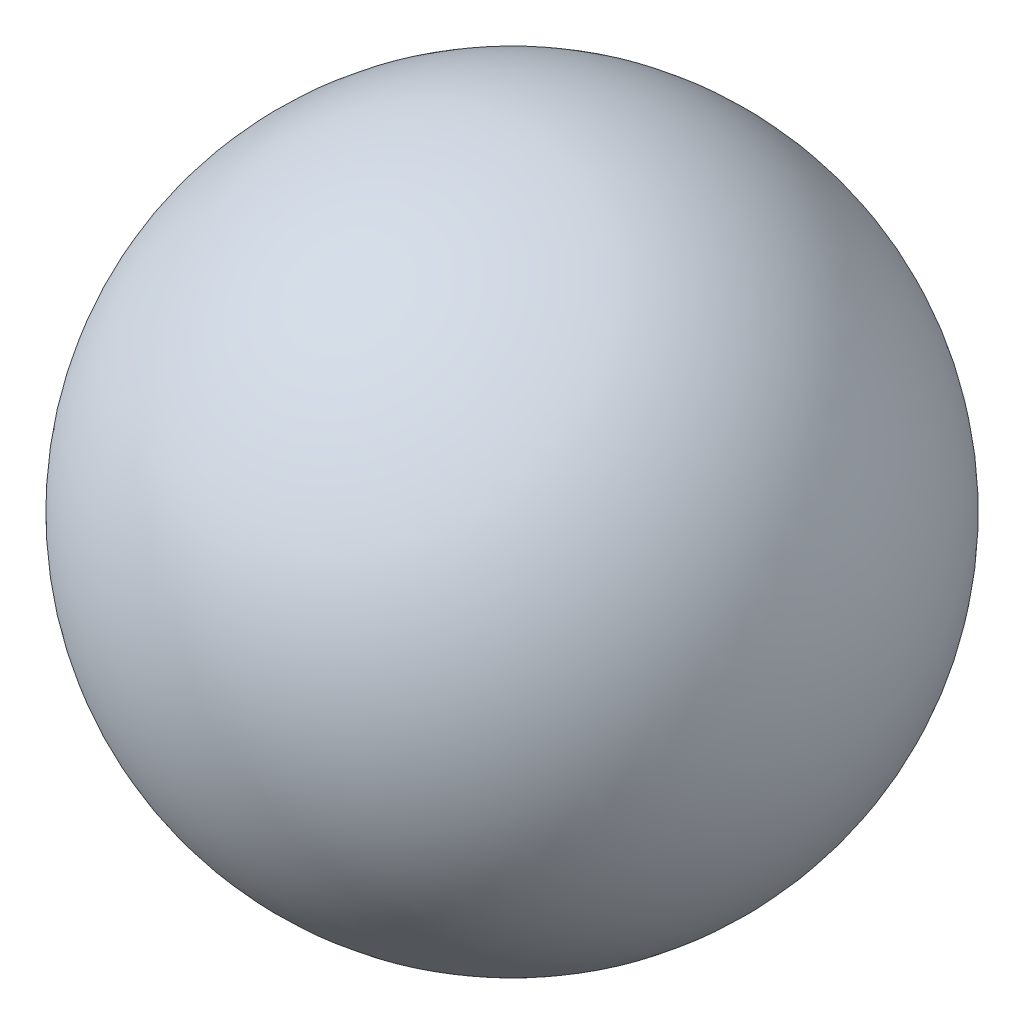
ISO-10303-21;
HEADER;
FILE_DESCRIPTION(('STEP AP214'),'2;1');
FILE_NAME('part.step','',(''),(''),'','','');
FILE_SCHEMA(('AUTOMOTIVE_DESIGN { 1 0 10303 214 1 1 1 1 }'));
ENDSEC;
DATA;
#1=APPLICATION_CONTEXT('core data for automotive mechanical design processes');
#2=APPLICATION_PROTOCOL_DEFINITION('international standard','automotive_design',2000,#1);
#3=PRODUCT_CONTEXT('',#1,'mechanical');
#4=PRODUCT('Part','Part','',(#3));
#5=PRODUCT_RELATED_PRODUCT_CATEGORY('part','',(#4));
#6=PRODUCT_DEFINITION_FORMATION('','',#4);
#7=PRODUCT_DEFINITION_CONTEXT('part definition',#1,'design');
#8=PRODUCT_DEFINITION('design','',#6,#7);
#9=PRODUCT_DEFINITION_SHAPE('','',#8);
#10=(LENGTH_UNIT() NAMED_UNIT(*) SI_UNIT(.MILLI.,.METRE.));
#11=(NAMED_UNIT(*) PLANE_ANGLE_UNIT() SI_UNIT($,.RADIAN.));
#12=(NAMED_UNIT(*) SI_UNIT($,.STERADIAN.) SOLID_ANGLE_UNIT());
#13=UNCERTAINTY_MEASURE_WITH_UNIT(LENGTH_MEASURE(1.E-05),#10,'distance_accuracy_value','');
#14=(GEOMETRIC_REPRESENTATION_CONTEXT(3) GLOBAL_UNCERTAINTY_ASSIGNED_CONTEXT((#13)) GLOBAL_UNIT_ASSIGNED_CONTEXT((#10,
#11,#12)) REPRESENTATION_CONTEXT('',''));
#15=CARTESIAN_POINT('',(0.,0.,0.));
#16=DIRECTION('',(0.,0.,1.));
#17=DIRECTION('',(1.,0.,0.));
#18=AXIS2_PLACEMENT_3D('',#15,#16,#17);
#19=CARTESIAN_POINT('',(0.,0.,0.));
#20=DIRECTION('',(0.,1.,0.));
#21=DIRECTION('',(1.,0.,0.));
#22=AXIS2_PLACEMENT_3D('',#19,#20,#21);
#23=SPHERICAL_SURFACE('',#22,20.);
#24=CARTESIAN_POINT('',(0.,20.,0.));
#25=VERTEX_POINT('',#24);
#26=VERTEX_LOOP('',#25);
#27=FACE_BOUND('',#26,.T.);
#28=ADVANCED_FACE('F34',(#27),#23,.T.);
#29=CLOSED_SHELL('',(#28));
#30=CARTESIAN_POINT('',(0.,0.,0.));
#31=DIRECTION('',(0.,1.,0.));
#32=DIRECTION('',(-1.,0.,0.));
#33=AXIS2_PLACEMENT_3D('',#30,#31,#32);
#34=SPHERICAL_SURFACE('',#33,19.);
#35=CARTESIAN_POINT('',(0.,19.,0.));
#36=VERTEX_POINT('',#35);
#37=VERTEX_LOOP('',#36);
#38=FACE_BOUND('',#37,.T.);
#39=ADVANCED_FACE('F47',(#38),#34,.F.);
#40=CLOSED_SHELL('',(#39));
#41=ORIENTED_CLOSED_SHELL('',*,#40,.T.);
#42=BREP_WITH_VOIDS('B2',#29,(#41));
#43=ADVANCED_BREP_SHAPE_REPRESENTATION('',(#18,#42),#14);
#44=SHAPE_DEFINITION_REPRESENTATION(#9,#43);
ENDSEC;
END-ISO-10303-21;
